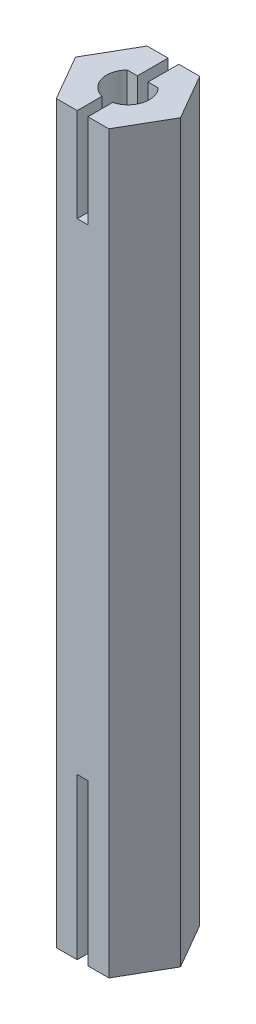
ISO-10303-21;
HEADER;
FILE_DESCRIPTION(('STEP AP214'),'2;1');
FILE_NAME('part.step','',(''),(''),'','','');
FILE_SCHEMA(('AUTOMOTIVE_DESIGN { 1 0 10303 214 1 1 1 1 }'));
ENDSEC;
DATA;
#1=APPLICATION_CONTEXT('core data for automotive mechanical design processes');
#2=APPLICATION_PROTOCOL_DEFINITION('international standard','automotive_design',2000,#1);
#3=PRODUCT_CONTEXT('',#1,'mechanical');
#4=PRODUCT('Part','Part','',(#3));
#5=PRODUCT_RELATED_PRODUCT_CATEGORY('part','',(#4));
#6=PRODUCT_DEFINITION_FORMATION('','',#4);
#7=PRODUCT_DEFINITION_CONTEXT('part definition',#1,'design');
#8=PRODUCT_DEFINITION('design','',#6,#7);
#9=PRODUCT_DEFINITION_SHAPE('','',#8);
#10=(LENGTH_UNIT() NAMED_UNIT(*) SI_UNIT(.MILLI.,.METRE.));
#11=(NAMED_UNIT(*) PLANE_ANGLE_UNIT() SI_UNIT($,.RADIAN.));
#12=(NAMED_UNIT(*) SI_UNIT($,.STERADIAN.) SOLID_ANGLE_UNIT());
#13=UNCERTAINTY_MEASURE_WITH_UNIT(LENGTH_MEASURE(1.E-05),#10,'distance_accuracy_value','');
#14=(GEOMETRIC_REPRESENTATION_CONTEXT(3) GLOBAL_UNCERTAINTY_ASSIGNED_CONTEXT((#13)) GLOBAL_UNIT_ASSIGNED_CONTEXT((#10,
#11,#12)) REPRESENTATION_CONTEXT('',''));
#15=CARTESIAN_POINT('',(0.,0.,0.));
#16=DIRECTION('',(0.,0.,1.));
#17=DIRECTION('',(1.,0.,0.));
#18=AXIS2_PLACEMENT_3D('',#15,#16,#17);
#19=CARTESIAN_POINT('',(0.,0.,0.));
#20=DIRECTION('',(0.,1.,0.));
#21=DIRECTION('',(0.,0.,1.));
#22=AXIS2_PLACEMENT_3D('',#19,#20,#21);
#23=PLANE('',#22);
#24=DIRECTION('',(-1.,0.,0.));
#25=VECTOR('',#24,1.);
#26=CARTESIAN_POINT('',(1.96299091524473,0.,-3.4));
#27=LINE('',#26,#25);
#28=CARTESIAN_POINT('',(-0.399999999999999,0.,-3.4));
#29=VERTEX_POINT('',#28);
#30=CARTESIAN_POINT('',(-1.96299091524473,0.,-3.4));
#31=VERTEX_POINT('',#30);
#32=EDGE_CURVE('E249',#29,#31,#27,.T.);
#33=ORIENTED_EDGE('',*,*,#32,.F.);
#34=DIRECTION('',(0.,0.,-1.));
#35=VECTOR('',#34,1.);
#36=CARTESIAN_POINT('',(-0.4,0.,3.4));
#37=LINE('',#36,#35);
#38=CARTESIAN_POINT('',(-0.399999999999999,0.,-2.6));
#39=VERTEX_POINT('',#38);
#40=EDGE_CURVE('E233',#39,#29,#37,.T.);
#41=ORIENTED_EDGE('',*,*,#40,.F.);
#42=DIRECTION('',(1.,0.,0.));
#43=VECTOR('',#42,1.);
#44=CARTESIAN_POINT('',(-1.50111069989303,0.,-2.6));
#45=LINE('',#44,#43);
#46=CARTESIAN_POINT('',(-1.50111069989303,0.,-2.6));
#47=VERTEX_POINT('',#46);
#48=EDGE_CURVE('E393',#47,#39,#45,.T.);
#49=ORIENTED_EDGE('',*,*,#48,.F.);
#50=DIRECTION('',(0.5,0.,-0.866025403784439));
#51=VECTOR('',#50,1.);
#52=CARTESIAN_POINT('',(-3.00222139978605,0.,0.));
#53=LINE('',#52,#51);
#54=CARTESIAN_POINT('',(-3.00222139978605,0.,0.));
#55=VERTEX_POINT('',#54);
#56=EDGE_CURVE('E369',#55,#47,#53,.T.);
#57=ORIENTED_EDGE('',*,*,#56,.F.);
#58=DIRECTION('',(-0.5,0.,-0.866025403784439));
#59=VECTOR('',#58,1.);
#60=CARTESIAN_POINT('',(-1.50111069989303,0.,2.6));
#61=LINE('',#60,#59);
#62=CARTESIAN_POINT('',(-1.50111069989303,0.,2.6));
#63=VERTEX_POINT('',#62);
#64=EDGE_CURVE('E374',#63,#55,#61,.T.);
#65=ORIENTED_EDGE('',*,*,#64,.F.);
#66=DIRECTION('',(-1.,0.,0.));
#67=VECTOR('',#66,1.);
#68=CARTESIAN_POINT('',(1.50111069989303,0.,2.6));
#69=LINE('',#68,#67);
#70=CARTESIAN_POINT('',(-0.4,0.,2.6));
#71=VERTEX_POINT('',#70);
#72=EDGE_CURVE('E401',#71,#63,#69,.T.);
#73=ORIENTED_EDGE('',*,*,#72,.F.);
#74=CARTESIAN_POINT('',(-0.4,0.,3.4));
#75=VERTEX_POINT('',#74);
#76=EDGE_CURVE('E244',#75,#71,#37,.T.);
#77=ORIENTED_EDGE('',*,*,#76,.F.);
#78=DIRECTION('',(1.,0.,0.));
#79=VECTOR('',#78,1.);
#80=CARTESIAN_POINT('',(-1.96299091524473,0.,3.4));
#81=LINE('',#80,#79);
#82=CARTESIAN_POINT('',(-1.96299091524473,0.,3.4));
#83=VERTEX_POINT('',#82);
#84=EDGE_CURVE('E271',#83,#75,#81,.T.);
#85=ORIENTED_EDGE('',*,*,#84,.F.);
#86=DIRECTION('',(0.5,0.,0.866025403784439));
#87=VECTOR('',#86,1.);
#88=CARTESIAN_POINT('',(-3.92598183048946,0.,0.));
#89=LINE('',#88,#87);
#90=CARTESIAN_POINT('',(-3.92598183048946,0.,0.));
#91=VERTEX_POINT('',#90);
#92=EDGE_CURVE('E268',#91,#83,#89,.T.);
#93=ORIENTED_EDGE('',*,*,#92,.F.);
#94=DIRECTION('',(-0.5,0.,0.866025403784439));
#95=VECTOR('',#94,1.);
#96=CARTESIAN_POINT('',(-1.96299091524473,0.,-3.4));
#97=LINE('',#96,#95);
#98=EDGE_CURVE('E258',#31,#91,#97,.T.);
#99=ORIENTED_EDGE('',*,*,#98,.F.);
#100=EDGE_LOOP('',(#33,#41,#49,#57,#65,#73,#77,#85,#93,#99));
#101=FACE_BOUND('',#100,.T.);
#102=ADVANCED_FACE('F37',(#101),#23,.F.);
#103=CARTESIAN_POINT('',(1.50111069989303,12.,2.6));
#104=DIRECTION('',(0.,0.,1.));
#105=DIRECTION('',(1.,0.,0.));
#106=AXIS2_PLACEMENT_3D('',#103,#104,#105);
#107=PLANE('',#106);
#108=DIRECTION('',(-1.,0.,0.));
#109=VECTOR('',#108,1.);
#110=CARTESIAN_POINT('',(1.50111069989303,12.,2.6));
#111=LINE('',#110,#109);
#112=CARTESIAN_POINT('',(-0.4,12.,2.6));
#113=VERTEX_POINT('',#112);
#114=CARTESIAN_POINT('',(-1.50111069989303,12.,2.6));
#115=VERTEX_POINT('',#114);
#116=EDGE_CURVE('E384',#113,#115,#111,.T.);
#117=ORIENTED_EDGE('',*,*,#116,.F.);
#118=DIRECTION('',(0.,-1.,0.));
#119=VECTOR('',#118,1.);
#120=CARTESIAN_POINT('',(-0.4,12.,2.6));
#121=LINE('',#120,#119);
#122=EDGE_CURVE('E322',#113,#71,#121,.T.);
#123=ORIENTED_EDGE('',*,*,#122,.T.);
#124=ORIENTED_EDGE('',*,*,#72,.T.);
#125=DIRECTION('',(0.,-1.,0.));
#126=VECTOR('',#125,1.);
#127=CARTESIAN_POINT('',(-1.50111069989303,12.,2.6));
#128=LINE('',#127,#126);
#129=EDGE_CURVE('E410',#115,#63,#128,.T.);
#130=ORIENTED_EDGE('',*,*,#129,.F.);
#131=EDGE_LOOP('',(#117,#123,#124,#130));
#132=FACE_BOUND('',#131,.T.);
#133=ADVANCED_FACE('F501',(#132),#107,.F.);
#134=CARTESIAN_POINT('',(-1.50111069989303,12.,-2.6));
#135=DIRECTION('',(0.,0.,-1.));
#136=DIRECTION('',(-1.,0.,0.));
#137=AXIS2_PLACEMENT_3D('',#134,#135,#136);
#138=PLANE('',#137);
#139=ORIENTED_EDGE('',*,*,#48,.T.);
#140=DIRECTION('',(0.,1.,0.));
#141=VECTOR('',#140,1.);
#142=CARTESIAN_POINT('',(-0.399999999999999,12.,-2.6));
#143=LINE('',#142,#141);
#144=CARTESIAN_POINT('',(-0.399999999999999,12.,-2.6));
#145=VERTEX_POINT('',#144);
#146=EDGE_CURVE('E239',#39,#145,#143,.T.);
#147=ORIENTED_EDGE('',*,*,#146,.T.);
#148=DIRECTION('',(1.,0.,0.));
#149=VECTOR('',#148,1.);
#150=CARTESIAN_POINT('',(-1.50111069989303,12.,-2.6));
#151=LINE('',#150,#149);
#152=CARTESIAN_POINT('',(-1.50111069989303,12.,-2.6));
#153=VERTEX_POINT('',#152);
#154=EDGE_CURVE('E375',#153,#145,#151,.T.);
#155=ORIENTED_EDGE('',*,*,#154,.F.);
#156=DIRECTION('',(0.,-1.,0.));
#157=VECTOR('',#156,1.);
#158=CARTESIAN_POINT('',(-1.50111069989303,12.,-2.6));
#159=LINE('',#158,#157);
#160=EDGE_CURVE('E391',#153,#47,#159,.T.);
#161=ORIENTED_EDGE('',*,*,#160,.T.);
#162=EDGE_LOOP('',(#139,#147,#155,#161));
#163=FACE_BOUND('',#162,.T.);
#164=ADVANCED_FACE('F511',(#163),#138,.F.);
#165=CARTESIAN_POINT('',(0.,55.,0.));
#166=DIRECTION('',(0.,1.,0.));
#167=DIRECTION('',(0.,0.,1.));
#168=AXIS2_PLACEMENT_3D('',#165,#166,#167);
#169=PLANE('',#168);
#170=DIRECTION('',(0.,0.,1.));
#171=VECTOR('',#170,1.);
#172=CARTESIAN_POINT('',(-0.4,55.,-3.4));
#173=LINE('',#172,#171);
#174=CARTESIAN_POINT('',(-0.4,55.,-3.4));
#175=VERTEX_POINT('',#174);
#176=CARTESIAN_POINT('',(-0.4,55.,-1.1));
#177=VERTEX_POINT('',#176);
#178=EDGE_CURVE('E336',#175,#177,#173,.T.);
#179=ORIENTED_EDGE('',*,*,#178,.F.);
#180=DIRECTION('',(-1.,0.,0.));
#181=VECTOR('',#180,1.);
#182=CARTESIAN_POINT('',(1.96299091524473,55.,-3.4));
#183=LINE('',#182,#181);
#184=CARTESIAN_POINT('',(-1.96299091524473,55.,-3.4));
#185=VERTEX_POINT('',#184);
#186=EDGE_CURVE('E447',#175,#185,#183,.T.);
#187=ORIENTED_EDGE('',*,*,#186,.T.);
#188=DIRECTION('',(-0.5,0.,0.866025403784439));
#189=VECTOR('',#188,1.);
#190=CARTESIAN_POINT('',(-1.96299091524473,55.,-3.4));
#191=LINE('',#190,#189);
#192=CARTESIAN_POINT('',(-3.92598183048946,55.,0.));
#193=VERTEX_POINT('',#192);
#194=EDGE_CURVE('E449',#185,#193,#191,.T.);
#195=ORIENTED_EDGE('',*,*,#194,.T.);
#196=DIRECTION('',(0.5,0.,0.866025403784439));
#197=VECTOR('',#196,1.);
#198=CARTESIAN_POINT('',(-3.92598183048946,55.,0.));
#199=LINE('',#198,#197);
#200=CARTESIAN_POINT('',(-1.96299091524473,55.,3.4));
#201=VERTEX_POINT('',#200);
#202=EDGE_CURVE('E451',#193,#201,#199,.T.);
#203=ORIENTED_EDGE('',*,*,#202,.T.);
#204=DIRECTION('',(1.,0.,0.));
#205=VECTOR('',#204,1.);
#206=CARTESIAN_POINT('',(-1.96299091524473,55.,3.4));
#207=LINE('',#206,#205);
#208=CARTESIAN_POINT('',(-0.399999999999999,55.,3.4));
#209=VERTEX_POINT('',#208);
#210=EDGE_CURVE('E279',#201,#209,#207,.T.);
#211=ORIENTED_EDGE('',*,*,#210,.T.);
#212=CARTESIAN_POINT('',(-0.399999999999999,55.,1.54919333848297));
#213=VERTEX_POINT('',#212);
#214=EDGE_CURVE('E325',#213,#209,#173,.T.);
#215=ORIENTED_EDGE('',*,*,#214,.F.);
#216=CARTESIAN_POINT('',(0.,55.,0.));
#217=DIRECTION('',(0.,1.,0.));
#218=DIRECTION('',(0.,0.,1.));
#219=AXIS2_PLACEMENT_3D('',#216,#217,#218);
#220=CIRCLE('',#219,1.6);
#221=CARTESIAN_POINT('',(-1.16189500386223,55.,-1.1));
#222=VERTEX_POINT('',#221);
#223=EDGE_CURVE('E435',#222,#213,#220,.T.);
#224=ORIENTED_EDGE('',*,*,#223,.F.);
#225=DIRECTION('',(1.,0.,0.));
#226=VECTOR('',#225,1.);
#227=CARTESIAN_POINT('',(0.,55.,-1.1));
#228=LINE('',#227,#226);
#229=EDGE_CURVE('E431',#222,#177,#228,.T.);
#230=ORIENTED_EDGE('',*,*,#229,.T.);
#231=EDGE_LOOP('',(#179,#187,#195,#203,#211,#215,#224,#230));
#232=FACE_BOUND('',#231,.T.);
#233=ADVANCED_FACE('F513',(#232),#169,.T.);
#234=CARTESIAN_POINT('',(0.,48.,-1.1));
#235=DIRECTION('',(0.,0.,1.));
#236=DIRECTION('',(1.,0.,0.));
#237=AXIS2_PLACEMENT_3D('',#234,#235,#236);
#238=PLANE('',#237);
#239=DIRECTION('',(0.,-1.,0.));
#240=VECTOR('',#239,1.);
#241=CARTESIAN_POINT('',(-0.4,48.,-1.1));
#242=LINE('',#241,#240);
#243=CARTESIAN_POINT('',(-0.4,48.,-1.1));
#244=VERTEX_POINT('',#243);
#245=EDGE_CURVE('E360',#177,#244,#242,.T.);
#246=ORIENTED_EDGE('',*,*,#245,.F.);
#247=ORIENTED_EDGE('',*,*,#229,.F.);
#248=DIRECTION('',(0.,1.,0.));
#249=VECTOR('',#248,1.);
#250=CARTESIAN_POINT('',(-1.16189500386223,48.,-1.1));
#251=LINE('',#250,#249);
#252=CARTESIAN_POINT('',(-1.16189500386223,48.,-1.1));
#253=VERTEX_POINT('',#252);
#254=EDGE_CURVE('E430',#253,#222,#251,.T.);
#255=ORIENTED_EDGE('',*,*,#254,.F.);
#256=DIRECTION('',(1.,0.,0.));
#257=VECTOR('',#256,1.);
#258=CARTESIAN_POINT('',(0.,48.,-1.1));
#259=LINE('',#258,#257);
#260=EDGE_CURVE('E422',#253,#244,#259,.T.);
#261=ORIENTED_EDGE('',*,*,#260,.T.);
#262=EDGE_LOOP('',(#246,#247,#255,#261));
#263=FACE_BOUND('',#262,.T.);
#264=ADVANCED_FACE('F519',(#263),#238,.T.);
#265=CARTESIAN_POINT('',(0.,48.,0.));
#266=DIRECTION('',(0.,1.,0.));
#267=DIRECTION('',(0.,0.,1.));
#268=AXIS2_PLACEMENT_3D('',#265,#266,#267);
#269=CYLINDRICAL_SURFACE('',#268,1.6);
#270=ORIENTED_EDGE('',*,*,#223,.T.);
#271=DIRECTION('',(0.,1.,0.));
#272=VECTOR('',#271,1.);
#273=CARTESIAN_POINT('',(-0.399999999999999,48.,1.54919333848297));
#274=LINE('',#273,#272);
#275=CARTESIAN_POINT('',(-0.399999999999999,48.,1.54919333848297));
#276=VERTEX_POINT('',#275);
#277=EDGE_CURVE('E357',#213,#276,#274,.F.);
#278=ORIENTED_EDGE('',*,*,#277,.T.);
#279=CARTESIAN_POINT('',(0.,48.,0.));
#280=DIRECTION('',(0.,1.,0.));
#281=DIRECTION('',(0.,0.,1.));
#282=AXIS2_PLACEMENT_3D('',#279,#280,#281);
#283=CIRCLE('',#282,1.6);
#284=EDGE_CURVE('E427',#253,#276,#283,.T.);
#285=ORIENTED_EDGE('',*,*,#284,.F.);
#286=ORIENTED_EDGE('',*,*,#254,.T.);
#287=EDGE_LOOP('',(#270,#278,#285,#286));
#288=FACE_BOUND('',#287,.T.);
#289=ADVANCED_FACE('F589',(#288),#269,.F.);
#290=DIRECTION('',(0.,0.,-1.));
#291=VECTOR('',#290,1.);
#292=CARTESIAN_POINT('',(0.4,55.,-3.4));
#293=LINE('',#292,#291);
#294=CARTESIAN_POINT('',(0.400000000000001,55.,3.4));
#295=VERTEX_POINT('',#294);
#296=CARTESIAN_POINT('',(0.400000000000001,55.,1.54919333848297));
#297=VERTEX_POINT('',#296);
#298=EDGE_CURVE('E339',#295,#297,#293,.T.);
#299=ORIENTED_EDGE('',*,*,#298,.F.);
#300=CARTESIAN_POINT('',(1.96299091524473,55.,3.4));
#301=VERTEX_POINT('',#300);
#302=EDGE_CURVE('E453',#295,#301,#207,.T.);
#303=ORIENTED_EDGE('',*,*,#302,.T.);
#304=DIRECTION('',(0.5,0.,-0.866025403784438));
#305=VECTOR('',#304,1.);
#306=CARTESIAN_POINT('',(1.96299091524473,55.,3.4));
#307=LINE('',#306,#305);
#308=CARTESIAN_POINT('',(3.92598183048946,55.,0.));
#309=VERTEX_POINT('',#308);
#310=EDGE_CURVE('E274',#301,#309,#307,.T.);
#311=ORIENTED_EDGE('',*,*,#310,.T.);
#312=DIRECTION('',(-0.5,0.,-0.866025403784438));
#313=VECTOR('',#312,1.);
#314=CARTESIAN_POINT('',(3.92598183048946,55.,0.));
#315=LINE('',#314,#313);
#316=CARTESIAN_POINT('',(1.96299091524473,55.,-3.4));
#317=VERTEX_POINT('',#316);
#318=EDGE_CURVE('E445',#309,#317,#315,.T.);
#319=ORIENTED_EDGE('',*,*,#318,.T.);
#320=CARTESIAN_POINT('',(0.4,55.,-3.4));
#321=VERTEX_POINT('',#320);
#322=EDGE_CURVE('E292',#317,#321,#183,.T.);
#323=ORIENTED_EDGE('',*,*,#322,.T.);
#324=CARTESIAN_POINT('',(0.4,55.,-1.1));
#325=VERTEX_POINT('',#324);
#326=EDGE_CURVE('E338',#325,#321,#293,.T.);
#327=ORIENTED_EDGE('',*,*,#326,.F.);
#328=CARTESIAN_POINT('',(1.16189500386223,55.,-1.1));
#329=VERTEX_POINT('',#328);
#330=EDGE_CURVE('E409',#325,#329,#228,.T.);
#331=ORIENTED_EDGE('',*,*,#330,.T.);
#332=EDGE_CURVE('E434',#297,#329,#220,.T.);
#333=ORIENTED_EDGE('',*,*,#332,.F.);
#334=EDGE_LOOP('',(#299,#303,#311,#319,#323,#327,#331,#333));
#335=FACE_BOUND('',#334,.T.);
#336=ADVANCED_FACE('F522',(#335),#169,.T.);
#337=CARTESIAN_POINT('',(1.96299091524473,55.,3.4));
#338=DIRECTION('',(-0.866025403784439,0.,-0.5));
#339=DIRECTION('',(-0.5,0.,0.866025403784439));
#340=AXIS2_PLACEMENT_3D('',#337,#338,#339);
#341=PLANE('',#340);
#342=DIRECTION('',(0.5,0.,-0.866025403784438));
#343=VECTOR('',#342,1.);
#344=CARTESIAN_POINT('',(1.96299091524473,0.,3.4));
#345=LINE('',#344,#343);
#346=CARTESIAN_POINT('',(1.96299091524473,0.,3.4));
#347=VERTEX_POINT('',#346);
#348=CARTESIAN_POINT('',(3.92598183048946,0.,0.));
#349=VERTEX_POINT('',#348);
#350=EDGE_CURVE('E263',#347,#349,#345,.T.);
#351=ORIENTED_EDGE('',*,*,#350,.T.);
#352=DIRECTION('',(0.,-1.,0.));
#353=VECTOR('',#352,1.);
#354=CARTESIAN_POINT('',(3.92598183048946,55.,0.));
#355=LINE('',#354,#353);
#356=EDGE_CURVE('E12',#309,#349,#355,.T.);
#357=ORIENTED_EDGE('',*,*,#356,.F.);
#358=ORIENTED_EDGE('',*,*,#310,.F.);
#359=DIRECTION('',(0.,-1.,0.));
#360=VECTOR('',#359,1.);
#361=CARTESIAN_POINT('',(1.96299091524473,55.,3.4));
#362=LINE('',#361,#360);
#363=EDGE_CURVE('E275',#301,#347,#362,.T.);
#364=ORIENTED_EDGE('',*,*,#363,.T.);
#365=EDGE_LOOP('',(#351,#357,#358,#364));
#366=FACE_BOUND('',#365,.T.);
#367=ADVANCED_FACE('F39',(#366),#341,.F.);
#368=CARTESIAN_POINT('',(3.92598183048946,55.,0.));
#369=DIRECTION('',(-0.866025403784439,0.,0.5));
#370=DIRECTION('',(0.5,0.,0.866025403784439));
#371=AXIS2_PLACEMENT_3D('',#368,#369,#370);
#372=PLANE('',#371);
#373=DIRECTION('',(-0.5,0.,-0.866025403784438));
#374=VECTOR('',#373,1.);
#375=CARTESIAN_POINT('',(3.92598183048946,0.,0.));
#376=LINE('',#375,#374);
#377=CARTESIAN_POINT('',(1.96299091524473,0.,-3.4));
#378=VERTEX_POINT('',#377);
#379=EDGE_CURVE('E260',#349,#378,#376,.T.);
#380=ORIENTED_EDGE('',*,*,#379,.T.);
#381=DIRECTION('',(0.,-1.,0.));
#382=VECTOR('',#381,1.);
#383=CARTESIAN_POINT('',(1.96299091524473,55.,-3.4));
#384=LINE('',#383,#382);
#385=EDGE_CURVE('E45',#317,#378,#384,.T.);
#386=ORIENTED_EDGE('',*,*,#385,.F.);
#387=ORIENTED_EDGE('',*,*,#318,.F.);
#388=ORIENTED_EDGE('',*,*,#356,.T.);
#389=EDGE_LOOP('',(#380,#386,#387,#388));
#390=FACE_BOUND('',#389,.T.);
#391=ADVANCED_FACE('F553',(#390),#372,.F.);
#392=CARTESIAN_POINT('',(1.96299091524473,55.,-3.4));
#393=DIRECTION('',(0.,0.,1.));
#394=DIRECTION('',(1.,0.,0.));
#395=AXIS2_PLACEMENT_3D('',#392,#393,#394);
#396=PLANE('',#395);
#397=DIRECTION('',(-1.,0.,0.));
#398=VECTOR('',#397,1.);
#399=CARTESIAN_POINT('',(-0.399999999999999,12.,-3.4));
#400=LINE('',#399,#398);
#401=CARTESIAN_POINT('',(0.400000000000001,12.,-3.4));
#402=VERTEX_POINT('',#401);
#403=CARTESIAN_POINT('',(-0.399999999999999,12.,-3.4));
#404=VERTEX_POINT('',#403);
#405=EDGE_CURVE('E252',#402,#404,#400,.T.);
#406=ORIENTED_EDGE('',*,*,#405,.T.);
#407=DIRECTION('',(0.,-1.,0.));
#408=VECTOR('',#407,1.);
#409=CARTESIAN_POINT('',(-0.399999999999999,18.8468971074495,-3.4));
#410=LINE('',#409,#408);
#411=EDGE_CURVE('E236',#404,#29,#410,.T.);
#412=ORIENTED_EDGE('',*,*,#411,.T.);
#413=ORIENTED_EDGE('',*,*,#32,.T.);
#414=DIRECTION('',(0.,-1.,0.));
#415=VECTOR('',#414,1.);
#416=CARTESIAN_POINT('',(-1.96299091524473,55.,-3.4));
#417=LINE('',#416,#415);
#418=EDGE_CURVE('E285',#185,#31,#417,.T.);
#419=ORIENTED_EDGE('',*,*,#418,.F.);
#420=ORIENTED_EDGE('',*,*,#186,.F.);
#421=DIRECTION('',(0.,1.,0.));
#422=VECTOR('',#421,1.);
#423=CARTESIAN_POINT('',(-0.4,41.1531028925505,-3.4));
#424=LINE('',#423,#422);
#425=CARTESIAN_POINT('',(-0.4,48.,-3.4));
#426=VERTEX_POINT('',#425);
#427=EDGE_CURVE('E342',#426,#175,#424,.T.);
#428=ORIENTED_EDGE('',*,*,#427,.F.);
#429=DIRECTION('',(1.,0.,0.));
#430=VECTOR('',#429,1.);
#431=CARTESIAN_POINT('',(-0.4,48.,-3.4));
#432=LINE('',#431,#430);
#433=CARTESIAN_POINT('',(0.4,48.,-3.4));
#434=VERTEX_POINT('',#433);
#435=EDGE_CURVE('E328',#426,#434,#432,.T.);
#436=ORIENTED_EDGE('',*,*,#435,.T.);
#437=DIRECTION('',(0.,1.,0.));
#438=VECTOR('',#437,1.);
#439=CARTESIAN_POINT('',(0.4,41.1531028925505,-3.4));
#440=LINE('',#439,#438);
#441=EDGE_CURVE('E344',#434,#321,#440,.T.);
#442=ORIENTED_EDGE('',*,*,#441,.T.);
#443=ORIENTED_EDGE('',*,*,#322,.F.);
#444=ORIENTED_EDGE('',*,*,#385,.T.);
#445=CARTESIAN_POINT('',(0.400000000000001,0.,-3.4));
#446=VERTEX_POINT('',#445);
#447=EDGE_CURVE('E259',#378,#446,#27,.T.);
#448=ORIENTED_EDGE('',*,*,#447,.T.);
#449=DIRECTION('',(0.,-1.,0.));
#450=VECTOR('',#449,1.);
#451=CARTESIAN_POINT('',(0.400000000000001,18.8468971074495,-3.4));
#452=LINE('',#451,#450);
#453=EDGE_CURVE('E253',#402,#446,#452,.T.);
#454=ORIENTED_EDGE('',*,*,#453,.F.);
#455=EDGE_LOOP('',(#406,#412,#413,#419,#420,#428,#436,#442,#443,#444,#448,#454));
#456=FACE_BOUND('',#455,.T.);
#457=ADVANCED_FACE('F247',(#456),#396,.F.);
#458=CARTESIAN_POINT('',(-1.96299091524473,55.,-3.4));
#459=DIRECTION('',(0.866025403784439,0.,0.5));
#460=DIRECTION('',(0.5,0.,-0.866025403784439));
#461=AXIS2_PLACEMENT_3D('',#458,#459,#460);
#462=PLANE('',#461);
#463=ORIENTED_EDGE('',*,*,#98,.T.);
#464=DIRECTION('',(0.,-1.,0.));
#465=VECTOR('',#464,1.);
#466=CARTESIAN_POINT('',(-3.92598183048946,55.,0.));
#467=LINE('',#466,#465);
#468=EDGE_CURVE('E282',#193,#91,#467,.T.);
#469=ORIENTED_EDGE('',*,*,#468,.F.);
#470=ORIENTED_EDGE('',*,*,#194,.F.);
#471=ORIENTED_EDGE('',*,*,#418,.T.);
#472=EDGE_LOOP('',(#463,#469,#470,#471));
#473=FACE_BOUND('',#472,.T.);
#474=ADVANCED_FACE('F545',(#473),#462,.F.);
#475=CARTESIAN_POINT('',(-3.92598183048946,55.,0.));
#476=DIRECTION('',(0.866025403784439,0.,-0.5));
#477=DIRECTION('',(-0.5,0.,-0.866025403784439));
#478=AXIS2_PLACEMENT_3D('',#475,#476,#477);
#479=PLANE('',#478);
#480=ORIENTED_EDGE('',*,*,#92,.T.);
#481=DIRECTION('',(0.,-1.,0.));
#482=VECTOR('',#481,1.);
#483=CARTESIAN_POINT('',(-1.96299091524473,55.,3.4));
#484=LINE('',#483,#482);
#485=EDGE_CURVE('E278',#201,#83,#484,.T.);
#486=ORIENTED_EDGE('',*,*,#485,.F.);
#487=ORIENTED_EDGE('',*,*,#202,.F.);
#488=ORIENTED_EDGE('',*,*,#468,.T.);
#489=EDGE_LOOP('',(#480,#486,#487,#488));
#490=FACE_BOUND('',#489,.T.);
#491=ADVANCED_FACE('F541',(#490),#479,.F.);
#492=CARTESIAN_POINT('',(-1.96299091524473,55.,3.4));
#493=DIRECTION('',(0.,0.,-1.));
#494=DIRECTION('',(-1.,0.,0.));
#495=AXIS2_PLACEMENT_3D('',#492,#493,#494);
#496=PLANE('',#495);
#497=ORIENTED_EDGE('',*,*,#84,.T.);
#498=DIRECTION('',(0.,-1.,0.));
#499=VECTOR('',#498,1.);
#500=CARTESIAN_POINT('',(-0.4,18.8468971074495,3.4));
#501=LINE('',#500,#499);
#502=CARTESIAN_POINT('',(-0.4,12.,3.4));
#503=VERTEX_POINT('',#502);
#504=EDGE_CURVE('E308',#503,#75,#501,.T.);
#505=ORIENTED_EDGE('',*,*,#504,.F.);
#506=DIRECTION('',(1.,0.,0.));
#507=VECTOR('',#506,1.);
#508=CARTESIAN_POINT('',(-0.4,12.,3.4));
#509=LINE('',#508,#507);
#510=CARTESIAN_POINT('',(0.4,12.,3.4));
#511=VERTEX_POINT('',#510);
#512=EDGE_CURVE('E468',#503,#511,#509,.T.);
#513=ORIENTED_EDGE('',*,*,#512,.T.);
#514=DIRECTION('',(0.,-1.,0.));
#515=VECTOR('',#514,1.);
#516=CARTESIAN_POINT('',(0.4,18.8468971074495,3.4));
#517=LINE('',#516,#515);
#518=CARTESIAN_POINT('',(0.4,0.,3.4));
#519=VERTEX_POINT('',#518);
#520=EDGE_CURVE('E310',#511,#519,#517,.T.);
#521=ORIENTED_EDGE('',*,*,#520,.T.);
#522=EDGE_CURVE('E270',#519,#347,#81,.T.);
#523=ORIENTED_EDGE('',*,*,#522,.T.);
#524=ORIENTED_EDGE('',*,*,#363,.F.);
#525=ORIENTED_EDGE('',*,*,#302,.F.);
#526=DIRECTION('',(0.,1.,0.));
#527=VECTOR('',#526,1.);
#528=CARTESIAN_POINT('',(0.400000000000001,41.1531028925505,3.4));
#529=LINE('',#528,#527);
#530=CARTESIAN_POINT('',(0.400000000000001,48.,3.4));
#531=VERTEX_POINT('',#530);
#532=EDGE_CURVE('E346',#531,#295,#529,.T.);
#533=ORIENTED_EDGE('',*,*,#532,.F.);
#534=DIRECTION('',(-1.,0.,0.));
#535=VECTOR('',#534,1.);
#536=CARTESIAN_POINT('',(-0.399999999999999,48.,3.4));
#537=LINE('',#536,#535);
#538=CARTESIAN_POINT('',(-0.399999999999999,48.,3.4));
#539=VERTEX_POINT('',#538);
#540=EDGE_CURVE('E335',#531,#539,#537,.T.);
#541=ORIENTED_EDGE('',*,*,#540,.T.);
#542=DIRECTION('',(0.,1.,0.));
#543=VECTOR('',#542,1.);
#544=CARTESIAN_POINT('',(-0.399999999999999,41.1531028925505,3.4));
#545=LINE('',#544,#543);
#546=EDGE_CURVE('E341',#539,#209,#545,.T.);
#547=ORIENTED_EDGE('',*,*,#546,.T.);
#548=ORIENTED_EDGE('',*,*,#210,.F.);
#549=ORIENTED_EDGE('',*,*,#485,.T.);
#550=EDGE_LOOP('',(#497,#505,#513,#521,#523,#524,#525,#533,#541,#547,#548,#549));
#551=FACE_BOUND('',#550,.T.);
#552=ADVANCED_FACE('F463',(#551),#496,.F.);
#553=ORIENTED_EDGE('',*,*,#522,.F.);
#554=DIRECTION('',(0.,0.,1.));
#555=VECTOR('',#554,1.);
#556=CARTESIAN_POINT('',(0.4,0.,3.4));
#557=LINE('',#556,#555);
#558=CARTESIAN_POINT('',(0.4,0.,2.6));
#559=VERTEX_POINT('',#558);
#560=EDGE_CURVE('E304',#559,#519,#557,.T.);
#561=ORIENTED_EDGE('',*,*,#560,.F.);
#562=CARTESIAN_POINT('',(1.50111069989303,0.,2.6));
#563=VERTEX_POINT('',#562);
#564=EDGE_CURVE('E402',#563,#559,#69,.T.);
#565=ORIENTED_EDGE('',*,*,#564,.F.);
#566=DIRECTION('',(-0.5,0.,0.866025403784438));
#567=VECTOR('',#566,1.);
#568=CARTESIAN_POINT('',(3.00222139978605,0.,0.));
#569=LINE('',#568,#567);
#570=CARTESIAN_POINT('',(3.00222139978605,0.,0.));
#571=VERTEX_POINT('',#570);
#572=EDGE_CURVE('E398',#571,#563,#569,.T.);
#573=ORIENTED_EDGE('',*,*,#572,.F.);
#574=DIRECTION('',(0.5,0.,0.866025403784439));
#575=VECTOR('',#574,1.);
#576=CARTESIAN_POINT('',(1.50111069989303,0.,-2.6));
#577=LINE('',#576,#575);
#578=CARTESIAN_POINT('',(1.50111069989303,0.,-2.6));
#579=VERTEX_POINT('',#578);
#580=EDGE_CURVE('E395',#579,#571,#577,.T.);
#581=ORIENTED_EDGE('',*,*,#580,.F.);
#582=CARTESIAN_POINT('',(0.400000000000001,0.,-2.6));
#583=VERTEX_POINT('',#582);
#584=EDGE_CURVE('E301',#583,#579,#45,.T.);
#585=ORIENTED_EDGE('',*,*,#584,.F.);
#586=EDGE_CURVE('E254',#446,#583,#557,.T.);
#587=ORIENTED_EDGE('',*,*,#586,.F.);
#588=ORIENTED_EDGE('',*,*,#447,.F.);
#589=ORIENTED_EDGE('',*,*,#379,.F.);
#590=ORIENTED_EDGE('',*,*,#350,.F.);
#591=EDGE_LOOP('',(#553,#561,#565,#573,#581,#585,#587,#588,#589,#590));
#592=FACE_BOUND('',#591,.T.);
#593=ADVANCED_FACE('F297',(#592),#23,.F.);
#594=DIRECTION('',(0.,1.,0.));
#595=VECTOR('',#594,1.);
#596=CARTESIAN_POINT('',(0.4,48.,-1.1));
#597=LINE('',#596,#595);
#598=CARTESIAN_POINT('',(0.4,48.,-1.1));
#599=VERTEX_POINT('',#598);
#600=EDGE_CURVE('E355',#599,#325,#597,.T.);
#601=ORIENTED_EDGE('',*,*,#600,.F.);
#602=CARTESIAN_POINT('',(1.16189500386223,48.,-1.1));
#603=VERTEX_POINT('',#602);
#604=EDGE_CURVE('E426',#599,#603,#259,.T.);
#605=ORIENTED_EDGE('',*,*,#604,.T.);
#606=DIRECTION('',(0.,1.,0.));
#607=VECTOR('',#606,1.);
#608=CARTESIAN_POINT('',(1.16189500386223,48.,-1.1));
#609=LINE('',#608,#607);
#610=EDGE_CURVE('E438',#603,#329,#609,.T.);
#611=ORIENTED_EDGE('',*,*,#610,.T.);
#612=ORIENTED_EDGE('',*,*,#330,.F.);
#613=EDGE_LOOP('',(#601,#605,#611,#612));
#614=FACE_BOUND('',#613,.T.);
#615=ADVANCED_FACE('F533',(#614),#238,.T.);
#616=CARTESIAN_POINT('',(0.400000000000001,48.,1.54919333848297));
#617=VERTEX_POINT('',#616);
#618=EDGE_CURVE('E425',#617,#603,#283,.T.);
#619=ORIENTED_EDGE('',*,*,#618,.F.);
#620=DIRECTION('',(0.,1.,0.));
#621=VECTOR('',#620,1.);
#622=CARTESIAN_POINT('',(0.4,48.,1.54919333848297));
#623=LINE('',#622,#621);
#624=EDGE_CURVE('E352',#617,#297,#623,.T.);
#625=ORIENTED_EDGE('',*,*,#624,.T.);
#626=ORIENTED_EDGE('',*,*,#332,.T.);
#627=ORIENTED_EDGE('',*,*,#610,.F.);
#628=EDGE_LOOP('',(#619,#625,#626,#627));
#629=FACE_BOUND('',#628,.T.);
#630=ADVANCED_FACE('F538',(#629),#269,.F.);
#631=CARTESIAN_POINT('',(0.,48.,0.));
#632=DIRECTION('',(0.,1.,0.));
#633=DIRECTION('',(0.,0.,1.));
#634=AXIS2_PLACEMENT_3D('',#631,#632,#633);
#635=PLANE('',#634);
#636=ORIENTED_EDGE('',*,*,#604,.F.);
#637=DIRECTION('',(0.,0.,1.));
#638=VECTOR('',#637,1.);
#639=CARTESIAN_POINT('',(0.4,48.,-3.4));
#640=LINE('',#639,#638);
#641=EDGE_CURVE('E326',#434,#599,#640,.T.);
#642=ORIENTED_EDGE('',*,*,#641,.F.);
#643=ORIENTED_EDGE('',*,*,#435,.F.);
#644=DIRECTION('',(0.,0.,-1.));
#645=VECTOR('',#644,1.);
#646=CARTESIAN_POINT('',(-0.4,48.,-3.4));
#647=LINE('',#646,#645);
#648=EDGE_CURVE('E332',#244,#426,#647,.T.);
#649=ORIENTED_EDGE('',*,*,#648,.F.);
#650=ORIENTED_EDGE('',*,*,#260,.F.);
#651=ORIENTED_EDGE('',*,*,#284,.T.);
#652=EDGE_CURVE('E333',#539,#276,#647,.T.);
#653=ORIENTED_EDGE('',*,*,#652,.F.);
#654=ORIENTED_EDGE('',*,*,#540,.F.);
#655=EDGE_CURVE('E329',#617,#531,#640,.T.);
#656=ORIENTED_EDGE('',*,*,#655,.F.);
#657=ORIENTED_EDGE('',*,*,#618,.T.);
#658=EDGE_LOOP('',(#636,#642,#643,#649,#650,#651,#653,#654,#656,#657));
#659=FACE_BOUND('',#658,.T.);
#660=ADVANCED_FACE('F569',(#659),#635,.T.);
#661=CARTESIAN_POINT('',(-3.00222139978605,12.,0.));
#662=DIRECTION('',(-0.866025403784438,0.,-0.5));
#663=DIRECTION('',(-0.5,0.,0.866025403784439));
#664=AXIS2_PLACEMENT_3D('',#661,#662,#663);
#665=PLANE('',#664);
#666=ORIENTED_EDGE('',*,*,#56,.T.);
#667=ORIENTED_EDGE('',*,*,#160,.F.);
#668=DIRECTION('',(0.5,0.,-0.866025403784439));
#669=VECTOR('',#668,1.);
#670=CARTESIAN_POINT('',(-3.00222139978605,12.,0.));
#671=LINE('',#670,#669);
#672=CARTESIAN_POINT('',(-3.00222139978605,12.,0.));
#673=VERTEX_POINT('',#672);
#674=EDGE_CURVE('E370',#673,#153,#671,.T.);
#675=ORIENTED_EDGE('',*,*,#674,.F.);
#676=DIRECTION('',(0.,-1.,0.));
#677=VECTOR('',#676,1.);
#678=CARTESIAN_POINT('',(-3.00222139978605,12.,0.));
#679=LINE('',#678,#677);
#680=EDGE_CURVE('E407',#673,#55,#679,.T.);
#681=ORIENTED_EDGE('',*,*,#680,.T.);
#682=EDGE_LOOP('',(#666,#667,#675,#681));
#683=FACE_BOUND('',#682,.T.);
#684=ADVANCED_FACE('F509',(#683),#665,.F.);
#685=CARTESIAN_POINT('',(-1.50111069989303,12.,2.6));
#686=DIRECTION('',(-0.866025403784439,0.,0.5));
#687=DIRECTION('',(0.5,0.,0.866025403784439));
#688=AXIS2_PLACEMENT_3D('',#685,#686,#687);
#689=PLANE('',#688);
#690=ORIENTED_EDGE('',*,*,#64,.T.);
#691=ORIENTED_EDGE('',*,*,#680,.F.);
#692=DIRECTION('',(-0.5,0.,-0.866025403784439));
#693=VECTOR('',#692,1.);
#694=CARTESIAN_POINT('',(-1.50111069989303,12.,2.6));
#695=LINE('',#694,#693);
#696=EDGE_CURVE('E388',#115,#673,#695,.T.);
#697=ORIENTED_EDGE('',*,*,#696,.F.);
#698=ORIENTED_EDGE('',*,*,#129,.T.);
#699=EDGE_LOOP('',(#690,#691,#697,#698));
#700=FACE_BOUND('',#699,.T.);
#701=ADVANCED_FACE('F506',(#700),#689,.F.);
#702=ORIENTED_EDGE('',*,*,#564,.T.);
#703=DIRECTION('',(0.,1.,0.));
#704=VECTOR('',#703,1.);
#705=CARTESIAN_POINT('',(0.4,12.,2.6));
#706=LINE('',#705,#704);
#707=CARTESIAN_POINT('',(0.4,12.,2.6));
#708=VERTEX_POINT('',#707);
#709=EDGE_CURVE('E318',#559,#708,#706,.T.);
#710=ORIENTED_EDGE('',*,*,#709,.T.);
#711=CARTESIAN_POINT('',(1.50111069989303,12.,2.6));
#712=VERTEX_POINT('',#711);
#713=EDGE_CURVE('E385',#712,#708,#111,.T.);
#714=ORIENTED_EDGE('',*,*,#713,.F.);
#715=DIRECTION('',(0.,-1.,0.));
#716=VECTOR('',#715,1.);
#717=CARTESIAN_POINT('',(1.50111069989303,12.,2.6));
#718=LINE('',#717,#716);
#719=EDGE_CURVE('E413',#712,#563,#718,.T.);
#720=ORIENTED_EDGE('',*,*,#719,.T.);
#721=EDGE_LOOP('',(#702,#710,#714,#720));
#722=FACE_BOUND('',#721,.T.);
#723=ADVANCED_FACE('F474',(#722),#107,.F.);
#724=CARTESIAN_POINT('',(3.00222139978605,12.,0.));
#725=DIRECTION('',(0.866025403784438,0.,0.5));
#726=DIRECTION('',(0.5,0.,-0.866025403784439));
#727=AXIS2_PLACEMENT_3D('',#724,#725,#726);
#728=PLANE('',#727);
#729=ORIENTED_EDGE('',*,*,#572,.T.);
#730=ORIENTED_EDGE('',*,*,#719,.F.);
#731=DIRECTION('',(-0.5,0.,0.866025403784438));
#732=VECTOR('',#731,1.);
#733=CARTESIAN_POINT('',(3.00222139978605,12.,0.));
#734=LINE('',#733,#732);
#735=CARTESIAN_POINT('',(3.00222139978605,12.,0.));
#736=VERTEX_POINT('',#735);
#737=EDGE_CURVE('E381',#736,#712,#734,.T.);
#738=ORIENTED_EDGE('',*,*,#737,.F.);
#739=DIRECTION('',(0.,-1.,0.));
#740=VECTOR('',#739,1.);
#741=CARTESIAN_POINT('',(3.00222139978605,12.,0.));
#742=LINE('',#741,#740);
#743=EDGE_CURVE('E415',#736,#571,#742,.T.);
#744=ORIENTED_EDGE('',*,*,#743,.T.);
#745=EDGE_LOOP('',(#729,#730,#738,#744));
#746=FACE_BOUND('',#745,.T.);
#747=ADVANCED_FACE('F479',(#746),#728,.F.);
#748=CARTESIAN_POINT('',(1.50111069989303,12.,-2.6));
#749=DIRECTION('',(0.866025403784439,0.,-0.5));
#750=DIRECTION('',(-0.5,0.,-0.866025403784439));
#751=AXIS2_PLACEMENT_3D('',#748,#749,#750);
#752=PLANE('',#751);
#753=ORIENTED_EDGE('',*,*,#580,.T.);
#754=ORIENTED_EDGE('',*,*,#743,.F.);
#755=DIRECTION('',(0.5,0.,0.866025403784439));
#756=VECTOR('',#755,1.);
#757=CARTESIAN_POINT('',(1.50111069989303,12.,-2.6));
#758=LINE('',#757,#756);
#759=CARTESIAN_POINT('',(1.50111069989303,12.,-2.6));
#760=VERTEX_POINT('',#759);
#761=EDGE_CURVE('E378',#760,#736,#758,.T.);
#762=ORIENTED_EDGE('',*,*,#761,.F.);
#763=DIRECTION('',(0.,-1.,0.));
#764=VECTOR('',#763,1.);
#765=CARTESIAN_POINT('',(1.50111069989303,12.,-2.6));
#766=LINE('',#765,#764);
#767=EDGE_CURVE('E417',#760,#579,#766,.T.);
#768=ORIENTED_EDGE('',*,*,#767,.T.);
#769=EDGE_LOOP('',(#753,#754,#762,#768));
#770=FACE_BOUND('',#769,.T.);
#771=ADVANCED_FACE('F482',(#770),#752,.F.);
#772=CARTESIAN_POINT('',(0.4,12.,-2.6));
#773=VERTEX_POINT('',#772);
#774=EDGE_CURVE('E373',#773,#760,#151,.T.);
#775=ORIENTED_EDGE('',*,*,#774,.F.);
#776=DIRECTION('',(0.,-1.,0.));
#777=VECTOR('',#776,1.);
#778=CARTESIAN_POINT('',(0.400000000000001,12.,-2.6));
#779=LINE('',#778,#777);
#780=EDGE_CURVE('E315',#773,#583,#779,.T.);
#781=ORIENTED_EDGE('',*,*,#780,.T.);
#782=ORIENTED_EDGE('',*,*,#584,.T.);
#783=ORIENTED_EDGE('',*,*,#767,.F.);
#784=EDGE_LOOP('',(#775,#781,#782,#783));
#785=FACE_BOUND('',#784,.T.);
#786=ADVANCED_FACE('F486',(#785),#138,.F.);
#787=CARTESIAN_POINT('',(0.,12.,0.));
#788=DIRECTION('',(0.,-1.,0.));
#789=DIRECTION('',(0.,0.,-1.));
#790=AXIS2_PLACEMENT_3D('',#787,#788,#789);
#791=PLANE('',#790);
#792=CARTESIAN_POINT('',(0.,12.,0.));
#793=DIRECTION('',(0.,-1.,0.));
#794=DIRECTION('',(0.,0.,-1.));
#795=AXIS2_PLACEMENT_3D('',#792,#793,#794);
#796=CIRCLE('',#795,1.9);
#797=CARTESIAN_POINT('',(0.,12.,-1.9));
#798=VERTEX_POINT('',#797);
#799=EDGE_CURVE('E363',#798,#798,#796,.T.);
#800=ORIENTED_EDGE('',*,*,#799,.F.);
#801=EDGE_LOOP('',(#800));
#802=FACE_BOUND('',#801,.T.);
#803=ORIENTED_EDGE('',*,*,#713,.T.);
#804=DIRECTION('',(0.,0.,-1.));
#805=VECTOR('',#804,1.);
#806=CARTESIAN_POINT('',(0.4,12.,3.4));
#807=LINE('',#806,#805);
#808=EDGE_CURVE('E471',#511,#708,#807,.T.);
#809=ORIENTED_EDGE('',*,*,#808,.F.);
#810=ORIENTED_EDGE('',*,*,#512,.F.);
#811=DIRECTION('',(0.,0.,1.));
#812=VECTOR('',#811,1.);
#813=CARTESIAN_POINT('',(-0.4,12.,3.4));
#814=LINE('',#813,#812);
#815=EDGE_CURVE('E52',#113,#503,#814,.T.);
#816=ORIENTED_EDGE('',*,*,#815,.F.);
#817=ORIENTED_EDGE('',*,*,#116,.T.);
#818=ORIENTED_EDGE('',*,*,#696,.T.);
#819=ORIENTED_EDGE('',*,*,#674,.T.);
#820=ORIENTED_EDGE('',*,*,#154,.T.);
#821=EDGE_CURVE('E316',#404,#145,#814,.T.);
#822=ORIENTED_EDGE('',*,*,#821,.F.);
#823=ORIENTED_EDGE('',*,*,#405,.F.);
#824=EDGE_CURVE('E59',#773,#402,#807,.T.);
#825=ORIENTED_EDGE('',*,*,#824,.F.);
#826=ORIENTED_EDGE('',*,*,#774,.T.);
#827=ORIENTED_EDGE('',*,*,#761,.T.);
#828=ORIENTED_EDGE('',*,*,#737,.T.);
#829=EDGE_LOOP('',(#803,#809,#810,#816,#817,#818,#819,#820,#822,#823,#825,#826,#827,#828));
#830=FACE_BOUND('',#829,.T.);
#831=ADVANCED_FACE('F475',(#802,#830),#791,.T.);
#832=CARTESIAN_POINT('',(0.,47.,0.));
#833=DIRECTION('',(0.,1.,0.));
#834=DIRECTION('',(0.,0.,1.));
#835=AXIS2_PLACEMENT_3D('',#832,#833,#834);
#836=PLANE('',#835);
#837=CARTESIAN_POINT('',(0.,47.,0.));
#838=DIRECTION('',(0.,1.,0.));
#839=DIRECTION('',(0.,0.,1.));
#840=AXIS2_PLACEMENT_3D('',#837,#838,#839);
#841=CIRCLE('',#840,1.9);
#842=CARTESIAN_POINT('',(0.,47.,1.9));
#843=VERTEX_POINT('',#842);
#844=EDGE_CURVE('E366',#843,#843,#841,.F.);
#845=ORIENTED_EDGE('',*,*,#844,.T.);
#846=EDGE_LOOP('',(#845));
#847=FACE_BOUND('',#846,.T.);
#848=ADVANCED_FACE('F626',(#847),#836,.F.);
#849=CARTESIAN_POINT('',(0.,53.3740115370178,0.));
#850=DIRECTION('',(0.,-1.,0.));
#851=DIRECTION('',(0.,0.,-1.));
#852=AXIS2_PLACEMENT_3D('',#849,#850,#851);
#853=CYLINDRICAL_SURFACE('',#852,1.9);
#854=ORIENTED_EDGE('',*,*,#799,.T.);
#855=EDGE_LOOP('',(#854));
#856=FACE_BOUND('',#855,.T.);
#857=ORIENTED_EDGE('',*,*,#844,.F.);
#858=EDGE_LOOP('',(#857));
#859=FACE_BOUND('',#858,.T.);
#860=ADVANCED_FACE('F621',(#856,#859),#853,.F.);
#861=CARTESIAN_POINT('',(0.4,41.1531028925505,-3.4));
#862=DIRECTION('',(1.,0.,0.));
#863=DIRECTION('',(0.,0.,-1.));
#864=AXIS2_PLACEMENT_3D('',#861,#862,#863);
#865=PLANE('',#864);
#866=ORIENTED_EDGE('',*,*,#655,.T.);
#867=ORIENTED_EDGE('',*,*,#532,.T.);
#868=ORIENTED_EDGE('',*,*,#298,.T.);
#869=ORIENTED_EDGE('',*,*,#624,.F.);
#870=EDGE_LOOP('',(#866,#867,#868,#869));
#871=FACE_BOUND('',#870,.T.);
#872=ADVANCED_FACE('F564',(#871),#865,.F.);
#873=CARTESIAN_POINT('',(-0.4,41.1531028925505,-3.4));
#874=DIRECTION('',(-1.,0.,0.));
#875=DIRECTION('',(0.,0.,1.));
#876=AXIS2_PLACEMENT_3D('',#873,#874,#875);
#877=PLANE('',#876);
#878=ORIENTED_EDGE('',*,*,#214,.T.);
#879=ORIENTED_EDGE('',*,*,#546,.F.);
#880=ORIENTED_EDGE('',*,*,#652,.T.);
#881=ORIENTED_EDGE('',*,*,#277,.F.);
#882=EDGE_LOOP('',(#878,#879,#880,#881));
#883=FACE_BOUND('',#882,.T.);
#884=ADVANCED_FACE('F574',(#883),#877,.F.);
#885=ORIENTED_EDGE('',*,*,#245,.T.);
#886=ORIENTED_EDGE('',*,*,#648,.T.);
#887=ORIENTED_EDGE('',*,*,#427,.T.);
#888=ORIENTED_EDGE('',*,*,#178,.T.);
#889=EDGE_LOOP('',(#885,#886,#887,#888));
#890=FACE_BOUND('',#889,.T.);
#891=ADVANCED_FACE('F585',(#890),#877,.F.);
#892=ORIENTED_EDGE('',*,*,#600,.T.);
#893=ORIENTED_EDGE('',*,*,#326,.T.);
#894=ORIENTED_EDGE('',*,*,#441,.F.);
#895=ORIENTED_EDGE('',*,*,#641,.T.);
#896=EDGE_LOOP('',(#892,#893,#894,#895));
#897=FACE_BOUND('',#896,.T.);
#898=ADVANCED_FACE('F609',(#897),#865,.F.);
#899=CARTESIAN_POINT('',(0.4,18.8468971074495,3.4));
#900=DIRECTION('',(1.,0.,0.));
#901=DIRECTION('',(0.,0.,-1.));
#902=AXIS2_PLACEMENT_3D('',#899,#900,#901);
#903=PLANE('',#902);
#904=ORIENTED_EDGE('',*,*,#824,.T.);
#905=ORIENTED_EDGE('',*,*,#453,.T.);
#906=ORIENTED_EDGE('',*,*,#586,.T.);
#907=ORIENTED_EDGE('',*,*,#780,.F.);
#908=EDGE_LOOP('',(#904,#905,#906,#907));
#909=FACE_BOUND('',#908,.T.);
#910=ADVANCED_FACE('F487',(#909),#903,.F.);
#911=CARTESIAN_POINT('',(-0.4,18.8468971074495,3.4));
#912=DIRECTION('',(-1.,0.,0.));
#913=DIRECTION('',(0.,0.,1.));
#914=AXIS2_PLACEMENT_3D('',#911,#912,#913);
#915=PLANE('',#914);
#916=ORIENTED_EDGE('',*,*,#40,.T.);
#917=ORIENTED_EDGE('',*,*,#411,.F.);
#918=ORIENTED_EDGE('',*,*,#821,.T.);
#919=ORIENTED_EDGE('',*,*,#146,.F.);
#920=EDGE_LOOP('',(#916,#917,#918,#919));
#921=FACE_BOUND('',#920,.T.);
#922=ADVANCED_FACE('F235',(#921),#915,.F.);
#923=ORIENTED_EDGE('',*,*,#815,.T.);
#924=ORIENTED_EDGE('',*,*,#504,.T.);
#925=ORIENTED_EDGE('',*,*,#76,.T.);
#926=ORIENTED_EDGE('',*,*,#122,.F.);
#927=EDGE_LOOP('',(#923,#924,#925,#926));
#928=FACE_BOUND('',#927,.T.);
#929=ADVANCED_FACE('F492',(#928),#915,.F.);
#930=ORIENTED_EDGE('',*,*,#560,.T.);
#931=ORIENTED_EDGE('',*,*,#520,.F.);
#932=ORIENTED_EDGE('',*,*,#808,.T.);
#933=ORIENTED_EDGE('',*,*,#709,.F.);
#934=EDGE_LOOP('',(#930,#931,#932,#933));
#935=FACE_BOUND('',#934,.T.);
#936=ADVANCED_FACE('F470',(#935),#903,.F.);
#937=CLOSED_SHELL('',(#102,#133,#164,#233,#264,#289,#336,#367,#391,#457,#474,#491,#552,#593,
#615,#630,#660,#684,#701,#723,#747,#771,#786,#831,#848,#860,#872,#884,#891,#898,#910,#922,#929,#936));
#938=MANIFOLD_SOLID_BREP('B2',#937);
#939=ADVANCED_BREP_SHAPE_REPRESENTATION('',(#18,#938),#14);
#940=SHAPE_DEFINITION_REPRESENTATION(#9,#939);
ENDSEC;
END-ISO-10303-21;
